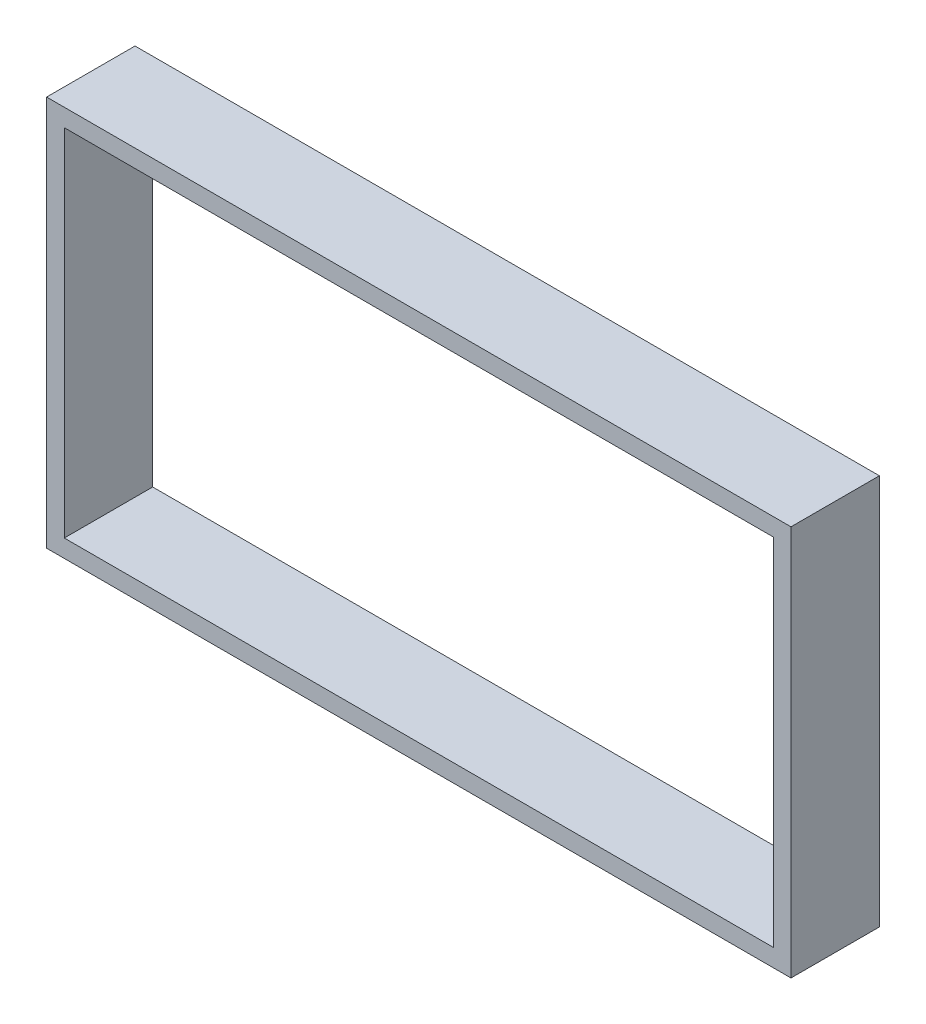
ISO-10303-21;
HEADER;
FILE_DESCRIPTION(('STEP AP214'),'2;1');
FILE_NAME('part.step','',(''),(''),'','','');
FILE_SCHEMA(('AUTOMOTIVE_DESIGN { 1 0 10303 214 1 1 1 1 }'));
ENDSEC;
DATA;
#1=APPLICATION_CONTEXT('core data for automotive mechanical design processes');
#2=APPLICATION_PROTOCOL_DEFINITION('international standard','automotive_design',2000,#1);
#3=PRODUCT_CONTEXT('',#1,'mechanical');
#4=PRODUCT('Part','Part','',(#3));
#5=PRODUCT_RELATED_PRODUCT_CATEGORY('part','',(#4));
#6=PRODUCT_DEFINITION_FORMATION('','',#4);
#7=PRODUCT_DEFINITION_CONTEXT('part definition',#1,'design');
#8=PRODUCT_DEFINITION('design','',#6,#7);
#9=PRODUCT_DEFINITION_SHAPE('','',#8);
#10=(LENGTH_UNIT() NAMED_UNIT(*) SI_UNIT(.MILLI.,.METRE.));
#11=(NAMED_UNIT(*) PLANE_ANGLE_UNIT() SI_UNIT($,.RADIAN.));
#12=(NAMED_UNIT(*) SI_UNIT($,.STERADIAN.) SOLID_ANGLE_UNIT());
#13=UNCERTAINTY_MEASURE_WITH_UNIT(LENGTH_MEASURE(1.E-05),#10,'distance_accuracy_value','');
#14=(GEOMETRIC_REPRESENTATION_CONTEXT(3) GLOBAL_UNCERTAINTY_ASSIGNED_CONTEXT((#13)) GLOBAL_UNIT_ASSIGNED_CONTEXT((#10,
#11,#12)) REPRESENTATION_CONTEXT('',''));
#15=CARTESIAN_POINT('',(0.,0.,0.));
#16=DIRECTION('',(0.,0.,1.));
#17=DIRECTION('',(1.,0.,0.));
#18=AXIS2_PLACEMENT_3D('',#15,#16,#17);
#19=CARTESIAN_POINT('',(0.,0.,10.));
#20=DIRECTION('',(0.,0.,1.));
#21=DIRECTION('',(1.,0.,0.));
#22=AXIS2_PLACEMENT_3D('',#19,#20,#21);
#23=PLANE('',#22);
#24=DIRECTION('',(0.,-1.,0.));
#25=VECTOR('',#24,1.);
#26=CARTESIAN_POINT('',(-47.2727272727279,13.7454545454542,10.));
#27=LINE('',#26,#25);
#28=CARTESIAN_POINT('',(-47.2727272727279,13.7454545454542,10.));
#29=VERTEX_POINT('',#28);
#30=CARTESIAN_POINT('',(-47.2727272727279,-30.4545454545459,10.));
#31=VERTEX_POINT('',#30);
#32=EDGE_CURVE('E140',#29,#31,#27,.T.);
#33=ORIENTED_EDGE('',*,*,#32,.T.);
#34=DIRECTION('',(1.,0.,0.));
#35=VECTOR('',#34,1.);
#36=CARTESIAN_POINT('',(-47.2727272727279,-30.4545454545459,10.));
#37=LINE('',#36,#35);
#38=CARTESIAN_POINT('',(36.9272727272721,-30.4545454545459,10.));
#39=VERTEX_POINT('',#38);
#40=EDGE_CURVE('E143',#31,#39,#37,.T.);
#41=ORIENTED_EDGE('',*,*,#40,.T.);
#42=DIRECTION('',(0.,1.,0.));
#43=VECTOR('',#42,1.);
#44=CARTESIAN_POINT('',(36.9272727272721,13.7454545454542,10.));
#45=LINE('',#44,#43);
#46=CARTESIAN_POINT('',(36.9272727272721,13.7454545454542,10.));
#47=VERTEX_POINT('',#46);
#48=EDGE_CURVE('E146',#39,#47,#45,.T.);
#49=ORIENTED_EDGE('',*,*,#48,.T.);
#50=DIRECTION('',(-1.,0.,0.));
#51=VECTOR('',#50,1.);
#52=CARTESIAN_POINT('',(-47.2727272727279,13.7454545454542,10.));
#53=LINE('',#52,#51);
#54=EDGE_CURVE('E148',#47,#29,#53,.T.);
#55=ORIENTED_EDGE('',*,*,#54,.T.);
#56=EDGE_LOOP('',(#33,#41,#49,#55));
#57=FACE_BOUND('',#56,.T.);
#58=DIRECTION('',(1.,0.,0.));
#59=VECTOR('',#58,1.);
#60=CARTESIAN_POINT('',(-45.2727272727279,-28.4545454545458,10.));
#61=LINE('',#60,#59);
#62=CARTESIAN_POINT('',(-45.2727272727279,-28.4545454545458,10.));
#63=VERTEX_POINT('',#62);
#64=CARTESIAN_POINT('',(34.9272727272721,-28.4545454545458,10.));
#65=VERTEX_POINT('',#64);
#66=EDGE_CURVE('E112',#63,#65,#61,.T.);
#67=ORIENTED_EDGE('',*,*,#66,.F.);
#68=DIRECTION('',(0.,-1.,0.));
#69=VECTOR('',#68,1.);
#70=CARTESIAN_POINT('',(-45.2727272727279,11.7454545454542,10.));
#71=LINE('',#70,#69);
#72=CARTESIAN_POINT('',(-45.2727272727279,11.7454545454542,10.));
#73=VERTEX_POINT('',#72);
#74=EDGE_CURVE('E104',#73,#63,#71,.T.);
#75=ORIENTED_EDGE('',*,*,#74,.F.);
#76=DIRECTION('',(-1.,0.,0.));
#77=VECTOR('',#76,1.);
#78=CARTESIAN_POINT('',(-45.2727272727279,11.7454545454542,10.));
#79=LINE('',#78,#77);
#80=CARTESIAN_POINT('',(34.9272727272721,11.7454545454542,10.));
#81=VERTEX_POINT('',#80);
#82=EDGE_CURVE('E126',#81,#73,#79,.T.);
#83=ORIENTED_EDGE('',*,*,#82,.F.);
#84=DIRECTION('',(0.,1.,0.));
#85=VECTOR('',#84,1.);
#86=CARTESIAN_POINT('',(34.9272727272721,11.7454545454542,10.));
#87=LINE('',#86,#85);
#88=EDGE_CURVE('E124',#65,#81,#87,.T.);
#89=ORIENTED_EDGE('',*,*,#88,.F.);
#90=EDGE_LOOP('',(#67,#75,#83,#89));
#91=FACE_BOUND('',#90,.T.);
#92=ADVANCED_FACE('F39',(#57,#91),#23,.T.);
#93=CARTESIAN_POINT('',(0.,0.,0.));
#94=DIRECTION('',(0.,0.,1.));
#95=DIRECTION('',(1.,0.,0.));
#96=AXIS2_PLACEMENT_3D('',#93,#94,#95);
#97=PLANE('',#96);
#98=DIRECTION('',(0.,-1.,0.));
#99=VECTOR('',#98,1.);
#100=CARTESIAN_POINT('',(-47.2727272727279,13.7454545454542,0.));
#101=LINE('',#100,#99);
#102=CARTESIAN_POINT('',(-47.2727272727279,13.7454545454542,0.));
#103=VERTEX_POINT('',#102);
#104=CARTESIAN_POINT('',(-47.2727272727279,-30.4545454545459,0.));
#105=VERTEX_POINT('',#104);
#106=EDGE_CURVE('E120',#103,#105,#101,.T.);
#107=ORIENTED_EDGE('',*,*,#106,.F.);
#108=DIRECTION('',(-1.,0.,0.));
#109=VECTOR('',#108,1.);
#110=CARTESIAN_POINT('',(-47.2727272727279,13.7454545454542,0.));
#111=LINE('',#110,#109);
#112=CARTESIAN_POINT('',(36.9272727272721,13.7454545454542,0.));
#113=VERTEX_POINT('',#112);
#114=EDGE_CURVE('E144',#113,#103,#111,.T.);
#115=ORIENTED_EDGE('',*,*,#114,.F.);
#116=DIRECTION('',(0.,1.,0.));
#117=VECTOR('',#116,1.);
#118=CARTESIAN_POINT('',(36.9272727272721,13.7454545454542,0.));
#119=LINE('',#118,#117);
#120=CARTESIAN_POINT('',(36.9272727272721,-30.4545454545459,0.));
#121=VERTEX_POINT('',#120);
#122=EDGE_CURVE('E155',#121,#113,#119,.T.);
#123=ORIENTED_EDGE('',*,*,#122,.F.);
#124=DIRECTION('',(1.,0.,0.));
#125=VECTOR('',#124,1.);
#126=CARTESIAN_POINT('',(-47.2727272727279,-30.4545454545459,0.));
#127=LINE('',#126,#125);
#128=EDGE_CURVE('E153',#105,#121,#127,.T.);
#129=ORIENTED_EDGE('',*,*,#128,.F.);
#130=EDGE_LOOP('',(#107,#115,#123,#129));
#131=FACE_BOUND('',#130,.T.);
#132=DIRECTION('',(0.,-1.,0.));
#133=VECTOR('',#132,1.);
#134=CARTESIAN_POINT('',(-45.2727272727279,11.7454545454542,0.));
#135=LINE('',#134,#133);
#136=CARTESIAN_POINT('',(-45.2727272727279,11.7454545454542,0.));
#137=VERTEX_POINT('',#136);
#138=CARTESIAN_POINT('',(-45.2727272727279,-28.4545454545458,0.));
#139=VERTEX_POINT('',#138);
#140=EDGE_CURVE('E62',#137,#139,#135,.T.);
#141=ORIENTED_EDGE('',*,*,#140,.T.);
#142=DIRECTION('',(1.,0.,0.));
#143=VECTOR('',#142,1.);
#144=CARTESIAN_POINT('',(-45.2727272727279,-28.4545454545458,0.));
#145=LINE('',#144,#143);
#146=CARTESIAN_POINT('',(34.9272727272721,-28.4545454545458,0.));
#147=VERTEX_POINT('',#146);
#148=EDGE_CURVE('E119',#139,#147,#145,.T.);
#149=ORIENTED_EDGE('',*,*,#148,.T.);
#150=DIRECTION('',(0.,1.,0.));
#151=VECTOR('',#150,1.);
#152=CARTESIAN_POINT('',(34.9272727272721,11.7454545454542,0.));
#153=LINE('',#152,#151);
#154=CARTESIAN_POINT('',(34.9272727272721,11.7454545454542,0.));
#155=VERTEX_POINT('',#154);
#156=EDGE_CURVE('E132',#147,#155,#153,.T.);
#157=ORIENTED_EDGE('',*,*,#156,.T.);
#158=DIRECTION('',(-1.,0.,0.));
#159=VECTOR('',#158,1.);
#160=CARTESIAN_POINT('',(-45.2727272727279,11.7454545454542,0.));
#161=LINE('',#160,#159);
#162=EDGE_CURVE('E113',#155,#137,#161,.T.);
#163=ORIENTED_EDGE('',*,*,#162,.T.);
#164=EDGE_LOOP('',(#141,#149,#157,#163));
#165=FACE_BOUND('',#164,.T.);
#166=ADVANCED_FACE('F173',(#131,#165),#97,.F.);
#167=CARTESIAN_POINT('',(-47.2727272727279,13.7454545454542,10.));
#168=DIRECTION('',(1.,0.,0.));
#169=DIRECTION('',(0.,1.,0.));
#170=AXIS2_PLACEMENT_3D('',#167,#168,#169);
#171=PLANE('',#170);
#172=ORIENTED_EDGE('',*,*,#106,.T.);
#173=DIRECTION('',(0.,0.,-1.));
#174=VECTOR('',#173,1.);
#175=CARTESIAN_POINT('',(-47.2727272727279,-30.4545454545459,10.));
#176=LINE('',#175,#174);
#177=EDGE_CURVE('E11',#31,#105,#176,.T.);
#178=ORIENTED_EDGE('',*,*,#177,.F.);
#179=ORIENTED_EDGE('',*,*,#32,.F.);
#180=DIRECTION('',(0.,0.,-1.));
#181=VECTOR('',#180,1.);
#182=CARTESIAN_POINT('',(-47.2727272727279,13.7454545454542,10.));
#183=LINE('',#182,#181);
#184=EDGE_CURVE('E150',#29,#103,#183,.T.);
#185=ORIENTED_EDGE('',*,*,#184,.T.);
#186=EDGE_LOOP('',(#172,#178,#179,#185));
#187=FACE_BOUND('',#186,.T.);
#188=ADVANCED_FACE('F41',(#187),#171,.F.);
#189=CARTESIAN_POINT('',(-47.2727272727279,-30.4545454545459,10.));
#190=DIRECTION('',(0.,1.,0.));
#191=DIRECTION('',(0.,0.,1.));
#192=AXIS2_PLACEMENT_3D('',#189,#190,#191);
#193=PLANE('',#192);
#194=ORIENTED_EDGE('',*,*,#128,.T.);
#195=DIRECTION('',(0.,0.,-1.));
#196=VECTOR('',#195,1.);
#197=CARTESIAN_POINT('',(36.9272727272721,-30.4545454545459,10.));
#198=LINE('',#197,#196);
#199=EDGE_CURVE('E47',#39,#121,#198,.T.);
#200=ORIENTED_EDGE('',*,*,#199,.F.);
#201=ORIENTED_EDGE('',*,*,#40,.F.);
#202=ORIENTED_EDGE('',*,*,#177,.T.);
#203=EDGE_LOOP('',(#194,#200,#201,#202));
#204=FACE_BOUND('',#203,.T.);
#205=ADVANCED_FACE('F183',(#204),#193,.F.);
#206=CARTESIAN_POINT('',(36.9272727272721,13.7454545454542,10.));
#207=DIRECTION('',(-1.,0.,0.));
#208=DIRECTION('',(0.,-1.,0.));
#209=AXIS2_PLACEMENT_3D('',#206,#207,#208);
#210=PLANE('',#209);
#211=ORIENTED_EDGE('',*,*,#122,.T.);
#212=DIRECTION('',(0.,0.,-1.));
#213=VECTOR('',#212,1.);
#214=CARTESIAN_POINT('',(36.9272727272721,13.7454545454542,10.));
#215=LINE('',#214,#213);
#216=EDGE_CURVE('E160',#47,#113,#215,.T.);
#217=ORIENTED_EDGE('',*,*,#216,.F.);
#218=ORIENTED_EDGE('',*,*,#48,.F.);
#219=ORIENTED_EDGE('',*,*,#199,.T.);
#220=EDGE_LOOP('',(#211,#217,#218,#219));
#221=FACE_BOUND('',#220,.T.);
#222=ADVANCED_FACE('F167',(#221),#210,.F.);
#223=CARTESIAN_POINT('',(-47.2727272727279,13.7454545454542,10.));
#224=DIRECTION('',(0.,-1.,0.));
#225=DIRECTION('',(0.,0.,-1.));
#226=AXIS2_PLACEMENT_3D('',#223,#224,#225);
#227=PLANE('',#226);
#228=ORIENTED_EDGE('',*,*,#114,.T.);
#229=ORIENTED_EDGE('',*,*,#184,.F.);
#230=ORIENTED_EDGE('',*,*,#54,.F.);
#231=ORIENTED_EDGE('',*,*,#216,.T.);
#232=EDGE_LOOP('',(#228,#229,#230,#231));
#233=FACE_BOUND('',#232,.T.);
#234=ADVANCED_FACE('F177',(#233),#227,.F.);
#235=CARTESIAN_POINT('',(-45.2727272727279,11.7454545454542,10.));
#236=DIRECTION('',(1.,0.,0.));
#237=DIRECTION('',(0.,0.,-1.));
#238=AXIS2_PLACEMENT_3D('',#235,#236,#237);
#239=PLANE('',#238);
#240=ORIENTED_EDGE('',*,*,#140,.F.);
#241=DIRECTION('',(0.,0.,-1.));
#242=VECTOR('',#241,1.);
#243=CARTESIAN_POINT('',(-45.2727272727279,11.7454545454542,10.));
#244=LINE('',#243,#242);
#245=EDGE_CURVE('E108',#73,#137,#244,.T.);
#246=ORIENTED_EDGE('',*,*,#245,.F.);
#247=ORIENTED_EDGE('',*,*,#74,.T.);
#248=DIRECTION('',(0.,0.,-1.));
#249=VECTOR('',#248,1.);
#250=CARTESIAN_POINT('',(-45.2727272727279,-28.4545454545458,10.));
#251=LINE('',#250,#249);
#252=EDGE_CURVE('E107',#63,#139,#251,.T.);
#253=ORIENTED_EDGE('',*,*,#252,.T.);
#254=EDGE_LOOP('',(#240,#246,#247,#253));
#255=FACE_BOUND('',#254,.T.);
#256=ADVANCED_FACE('F106',(#255),#239,.T.);
#257=CARTESIAN_POINT('',(-45.2727272727279,-28.4545454545458,10.));
#258=DIRECTION('',(0.,1.,0.));
#259=DIRECTION('',(0.,0.,1.));
#260=AXIS2_PLACEMENT_3D('',#257,#258,#259);
#261=PLANE('',#260);
#262=ORIENTED_EDGE('',*,*,#148,.F.);
#263=ORIENTED_EDGE('',*,*,#252,.F.);
#264=ORIENTED_EDGE('',*,*,#66,.T.);
#265=DIRECTION('',(0.,0.,-1.));
#266=VECTOR('',#265,1.);
#267=CARTESIAN_POINT('',(34.9272727272721,-28.4545454545458,10.));
#268=LINE('',#267,#266);
#269=EDGE_CURVE('E121',#65,#147,#268,.T.);
#270=ORIENTED_EDGE('',*,*,#269,.T.);
#271=EDGE_LOOP('',(#262,#263,#264,#270));
#272=FACE_BOUND('',#271,.T.);
#273=ADVANCED_FACE('F116',(#272),#261,.T.);
#274=CARTESIAN_POINT('',(34.9272727272721,11.7454545454542,10.));
#275=DIRECTION('',(-1.,0.,0.));
#276=DIRECTION('',(0.,0.,1.));
#277=AXIS2_PLACEMENT_3D('',#274,#275,#276);
#278=PLANE('',#277);
#279=ORIENTED_EDGE('',*,*,#156,.F.);
#280=ORIENTED_EDGE('',*,*,#269,.F.);
#281=ORIENTED_EDGE('',*,*,#88,.T.);
#282=DIRECTION('',(0.,0.,-1.));
#283=VECTOR('',#282,1.);
#284=CARTESIAN_POINT('',(34.9272727272721,11.7454545454542,10.));
#285=LINE('',#284,#283);
#286=EDGE_CURVE('E54',#81,#155,#285,.T.);
#287=ORIENTED_EDGE('',*,*,#286,.T.);
#288=EDGE_LOOP('',(#279,#280,#281,#287));
#289=FACE_BOUND('',#288,.T.);
#290=ADVANCED_FACE('F206',(#289),#278,.T.);
#291=CARTESIAN_POINT('',(-45.2727272727279,11.7454545454542,10.));
#292=DIRECTION('',(0.,-1.,0.));
#293=DIRECTION('',(0.,0.,-1.));
#294=AXIS2_PLACEMENT_3D('',#291,#292,#293);
#295=PLANE('',#294);
#296=ORIENTED_EDGE('',*,*,#162,.F.);
#297=ORIENTED_EDGE('',*,*,#286,.F.);
#298=ORIENTED_EDGE('',*,*,#82,.T.);
#299=ORIENTED_EDGE('',*,*,#245,.T.);
#300=EDGE_LOOP('',(#296,#297,#298,#299));
#301=FACE_BOUND('',#300,.T.);
#302=ADVANCED_FACE('F210',(#301),#295,.T.);
#303=CLOSED_SHELL('',(#92,#166,#188,#205,#222,#234,#256,#273,#290,#302));
#304=MANIFOLD_SOLID_BREP('B2',#303);
#305=ADVANCED_BREP_SHAPE_REPRESENTATION('',(#18,#304),#14);
#306=SHAPE_DEFINITION_REPRESENTATION(#9,#305);
ENDSEC;
END-ISO-10303-21;
